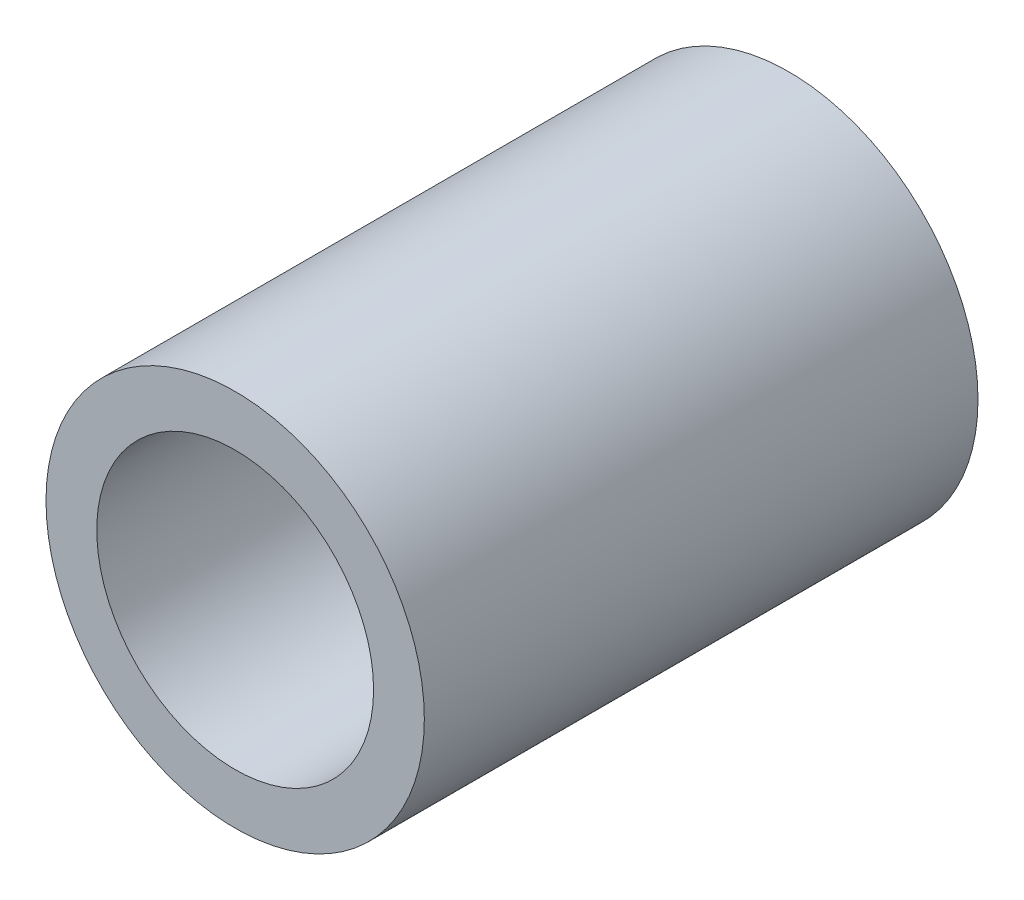
ISO-10303-21;
HEADER;
FILE_DESCRIPTION(('STEP AP214'),'2;1');
FILE_NAME('part.step','',(''),(''),'','','');
FILE_SCHEMA(('AUTOMOTIVE_DESIGN { 1 0 10303 214 1 1 1 1 }'));
ENDSEC;
DATA;
#1=APPLICATION_CONTEXT('core data for automotive mechanical design processes');
#2=APPLICATION_PROTOCOL_DEFINITION('international standard','automotive_design',2000,#1);
#3=PRODUCT_CONTEXT('',#1,'mechanical');
#4=PRODUCT('Part','Part','',(#3));
#5=PRODUCT_RELATED_PRODUCT_CATEGORY('part','',(#4));
#6=PRODUCT_DEFINITION_FORMATION('','',#4);
#7=PRODUCT_DEFINITION_CONTEXT('part definition',#1,'design');
#8=PRODUCT_DEFINITION('design','',#6,#7);
#9=PRODUCT_DEFINITION_SHAPE('','',#8);
#10=(LENGTH_UNIT() NAMED_UNIT(*) SI_UNIT(.MILLI.,.METRE.));
#11=(NAMED_UNIT(*) PLANE_ANGLE_UNIT() SI_UNIT($,.RADIAN.));
#12=(NAMED_UNIT(*) SI_UNIT($,.STERADIAN.) SOLID_ANGLE_UNIT());
#13=UNCERTAINTY_MEASURE_WITH_UNIT(LENGTH_MEASURE(1.E-05),#10,'distance_accuracy_value','');
#14=(GEOMETRIC_REPRESENTATION_CONTEXT(3) GLOBAL_UNCERTAINTY_ASSIGNED_CONTEXT((#13)) GLOBAL_UNIT_ASSIGNED_CONTEXT((#10,
#11,#12)) REPRESENTATION_CONTEXT('',''));
#15=CARTESIAN_POINT('',(0.,0.,0.));
#16=DIRECTION('',(0.,0.,1.));
#17=DIRECTION('',(1.,0.,0.));
#18=AXIS2_PLACEMENT_3D('',#15,#16,#17);
#19=CARTESIAN_POINT('',(0.,0.,120.));
#20=DIRECTION('',(0.,0.,-1.));
#21=DIRECTION('',(-1.,0.,0.));
#22=AXIS2_PLACEMENT_3D('',#19,#20,#21);
#23=CYLINDRICAL_SURFACE('',#22,41.);
#24=CARTESIAN_POINT('',(0.,0.,120.));
#25=DIRECTION('',(0.,0.,1.));
#26=DIRECTION('',(1.,0.,0.));
#27=AXIS2_PLACEMENT_3D('',#24,#25,#26);
#28=CIRCLE('',#27,41.);
#29=CARTESIAN_POINT('',(41.,0.,120.));
#30=VERTEX_POINT('',#29);
#31=EDGE_CURVE('E10',#30,#30,#28,.T.);
#32=ORIENTED_EDGE('',*,*,#31,.F.);
#33=EDGE_LOOP('',(#32));
#34=FACE_BOUND('',#33,.T.);
#35=CARTESIAN_POINT('',(0.,0.,0.));
#36=DIRECTION('',(0.,0.,1.));
#37=DIRECTION('',(1.,0.,0.));
#38=AXIS2_PLACEMENT_3D('',#35,#36,#37);
#39=CIRCLE('',#38,41.);
#40=CARTESIAN_POINT('',(41.,0.,0.));
#41=VERTEX_POINT('',#40);
#42=EDGE_CURVE('E45',#41,#41,#39,.T.);
#43=ORIENTED_EDGE('',*,*,#42,.T.);
#44=EDGE_LOOP('',(#43));
#45=FACE_BOUND('',#44,.T.);
#46=ADVANCED_FACE('F37',(#34,#45),#23,.T.);
#47=CARTESIAN_POINT('',(0.,0.,120.));
#48=DIRECTION('',(0.,0.,1.));
#49=DIRECTION('',(1.,0.,0.));
#50=AXIS2_PLACEMENT_3D('',#47,#48,#49);
#51=PLANE('',#50);
#52=CARTESIAN_POINT('',(0.,0.,120.));
#53=DIRECTION('',(0.,0.,1.));
#54=DIRECTION('',(1.,0.,0.));
#55=AXIS2_PLACEMENT_3D('',#52,#53,#54);
#56=CIRCLE('',#55,30.);
#57=CARTESIAN_POINT('',(30.,0.,120.));
#58=VERTEX_POINT('',#57);
#59=EDGE_CURVE('E52',#58,#58,#56,.T.);
#60=ORIENTED_EDGE('',*,*,#59,.F.);
#61=EDGE_LOOP('',(#60));
#62=FACE_BOUND('',#61,.T.);
#63=ORIENTED_EDGE('',*,*,#31,.T.);
#64=EDGE_LOOP('',(#63));
#65=FACE_BOUND('',#64,.T.);
#66=ADVANCED_FACE('F70',(#62,#65),#51,.T.);
#67=CARTESIAN_POINT('',(0.,0.,0.));
#68=DIRECTION('',(0.,0.,1.));
#69=DIRECTION('',(1.,0.,0.));
#70=AXIS2_PLACEMENT_3D('',#67,#68,#69);
#71=PLANE('',#70);
#72=CARTESIAN_POINT('',(0.,0.,0.));
#73=DIRECTION('',(0.,0.,1.));
#74=DIRECTION('',(1.,0.,0.));
#75=AXIS2_PLACEMENT_3D('',#72,#73,#74);
#76=CIRCLE('',#75,30.);
#77=CARTESIAN_POINT('',(30.,0.,0.));
#78=VERTEX_POINT('',#77);
#79=EDGE_CURVE('E40',#78,#78,#76,.T.);
#80=ORIENTED_EDGE('',*,*,#79,.T.);
#81=EDGE_LOOP('',(#80));
#82=FACE_BOUND('',#81,.T.);
#83=ORIENTED_EDGE('',*,*,#42,.F.);
#84=EDGE_LOOP('',(#83));
#85=FACE_BOUND('',#84,.T.);
#86=ADVANCED_FACE('F61',(#82,#85),#71,.F.);
#87=CARTESIAN_POINT('',(0.,0.,-10.));
#88=DIRECTION('',(0.,0.,1.));
#89=DIRECTION('',(1.,0.,0.));
#90=AXIS2_PLACEMENT_3D('',#87,#88,#89);
#91=CYLINDRICAL_SURFACE('',#90,30.);
#92=ORIENTED_EDGE('',*,*,#59,.T.);
#93=EDGE_LOOP('',(#92));
#94=FACE_BOUND('',#93,.T.);
#95=ORIENTED_EDGE('',*,*,#79,.F.);
#96=EDGE_LOOP('',(#95));
#97=FACE_BOUND('',#96,.T.);
#98=ADVANCED_FACE('F64',(#94,#97),#91,.F.);
#99=CLOSED_SHELL('',(#46,#66,#86,#98));
#100=MANIFOLD_SOLID_BREP('B2',#99);
#101=ADVANCED_BREP_SHAPE_REPRESENTATION('',(#18,#100),#14);
#102=SHAPE_DEFINITION_REPRESENTATION(#9,#101);
ENDSEC;
END-ISO-10303-21;
